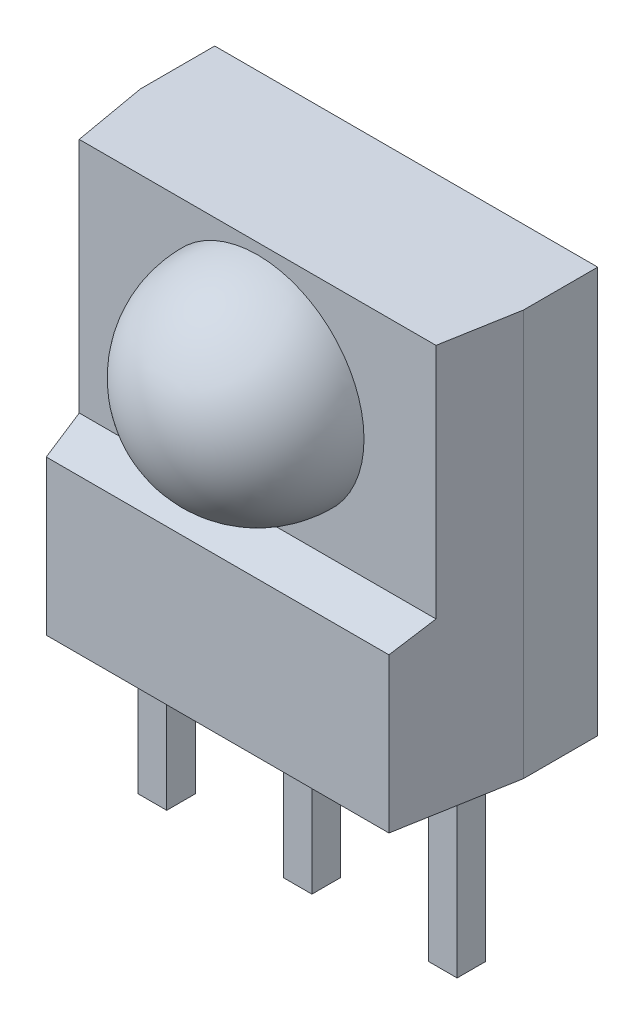
ISO-10303-21;
HEADER;
FILE_DESCRIPTION(('STEP AP214'),'2;1');
FILE_NAME('part.step','',(''),(''),'','','');
FILE_SCHEMA(('AUTOMOTIVE_DESIGN { 1 0 10303 214 1 1 1 1 }'));
ENDSEC;
DATA;
#1=APPLICATION_CONTEXT('core data for automotive mechanical design processes');
#2=APPLICATION_PROTOCOL_DEFINITION('international standard','automotive_design',2000,#1);
#3=PRODUCT_CONTEXT('',#1,'mechanical');
#4=PRODUCT('Part','Part','',(#3));
#5=PRODUCT_RELATED_PRODUCT_CATEGORY('part','',(#4));
#6=PRODUCT_DEFINITION_FORMATION('','',#4);
#7=PRODUCT_DEFINITION_CONTEXT('part definition',#1,'design');
#8=PRODUCT_DEFINITION('design','',#6,#7);
#9=PRODUCT_DEFINITION_SHAPE('','',#8);
#10=(LENGTH_UNIT() NAMED_UNIT(*) SI_UNIT(.MILLI.,.METRE.));
#11=(NAMED_UNIT(*) PLANE_ANGLE_UNIT() SI_UNIT($,.RADIAN.));
#12=(NAMED_UNIT(*) SI_UNIT($,.STERADIAN.) SOLID_ANGLE_UNIT());
#13=UNCERTAINTY_MEASURE_WITH_UNIT(LENGTH_MEASURE(1.E-05),#10,'distance_accuracy_value','');
#14=(GEOMETRIC_REPRESENTATION_CONTEXT(3) GLOBAL_UNCERTAINTY_ASSIGNED_CONTEXT((#13)) GLOBAL_UNIT_ASSIGNED_CONTEXT((#10,
#11,#12)) REPRESENTATION_CONTEXT('',''));
#15=CARTESIAN_POINT('',(0.,0.,0.));
#16=DIRECTION('',(0.,0.,1.));
#17=DIRECTION('',(1.,0.,0.));
#18=AXIS2_PLACEMENT_3D('',#15,#16,#17);
#19=CARTESIAN_POINT('',(0.,0.,0.));
#20=DIRECTION('',(0.,-1.,0.));
#21=DIRECTION('',(0.,0.,-1.));
#22=AXIS2_PLACEMENT_3D('',#19,#20,#21);
#23=PLANE('',#22);
#24=DIRECTION('',(-1.,0.,0.));
#25=VECTOR('',#24,1.);
#26=CARTESIAN_POINT('',(-0.25,0.,0.25));
#27=LINE('',#26,#25);
#28=CARTESIAN_POINT('',(0.249999999999995,0.,0.25));
#29=VERTEX_POINT('',#28);
#30=CARTESIAN_POINT('',(-0.25,0.,0.25));
#31=VERTEX_POINT('',#30);
#32=EDGE_CURVE('E201',#29,#31,#27,.T.);
#33=ORIENTED_EDGE('',*,*,#32,.F.);
#34=DIRECTION('',(0.,0.,1.));
#35=VECTOR('',#34,1.);
#36=CARTESIAN_POINT('',(0.249999999999995,0.,-0.25));
#37=LINE('',#36,#35);
#38=CARTESIAN_POINT('',(0.249999999999995,0.,-0.25));
#39=VERTEX_POINT('',#38);
#40=EDGE_CURVE('E198',#39,#29,#37,.T.);
#41=ORIENTED_EDGE('',*,*,#40,.F.);
#42=DIRECTION('',(1.,0.,0.));
#43=VECTOR('',#42,1.);
#44=CARTESIAN_POINT('',(-0.25,0.,-0.25));
#45=LINE('',#44,#43);
#46=CARTESIAN_POINT('',(-0.25,0.,-0.25));
#47=VERTEX_POINT('',#46);
#48=EDGE_CURVE('E211',#47,#39,#45,.T.);
#49=ORIENTED_EDGE('',*,*,#48,.F.);
#50=DIRECTION('',(0.,0.,-1.));
#51=VECTOR('',#50,1.);
#52=CARTESIAN_POINT('',(-0.25,0.,-0.25));
#53=LINE('',#52,#51);
#54=EDGE_CURVE('E219',#31,#47,#53,.T.);
#55=ORIENTED_EDGE('',*,*,#54,.F.);
#56=EDGE_LOOP('',(#33,#41,#49,#55));
#57=FACE_BOUND('',#56,.T.);
#58=DIRECTION('',(0.,0.,-1.));
#59=VECTOR('',#58,1.);
#60=CARTESIAN_POINT('',(3.34999999999998,0.,1.65));
#61=LINE('',#60,#59);
#62=CARTESIAN_POINT('',(3.34999999999998,0.,-0.350000000000031));
#63=VERTEX_POINT('',#62);
#64=CARTESIAN_POINT('',(3.34999999999998,0.,-1.65));
#65=VERTEX_POINT('',#64);
#66=EDGE_CURVE('E266',#63,#65,#61,.T.);
#67=ORIENTED_EDGE('',*,*,#66,.F.);
#68=DIRECTION('',(0.173648177666927,0.,-0.984807753012209));
#69=VECTOR('',#68,1.);
#70=CARTESIAN_POINT('',(3.18913161473439,0.,0.562329948708015));
#71=LINE('',#70,#69);
#72=CARTESIAN_POINT('',(2.99734603858306,0.,1.65));
#73=VERTEX_POINT('',#72);
#74=EDGE_CURVE('E298',#63,#73,#71,.F.);
#75=ORIENTED_EDGE('',*,*,#74,.T.);
#76=DIRECTION('',(1.,0.,0.));
#77=VECTOR('',#76,1.);
#78=CARTESIAN_POINT('',(-3.35000000000002,0.,1.65));
#79=LINE('',#78,#77);
#80=CARTESIAN_POINT('',(-2.99734603858308,0.,1.65));
#81=VERTEX_POINT('',#80);
#82=EDGE_CURVE('E270',#81,#73,#79,.T.);
#83=ORIENTED_EDGE('',*,*,#82,.F.);
#84=DIRECTION('',(0.173648177666927,0.,0.984807753012209));
#85=VECTOR('',#84,1.);
#86=CARTESIAN_POINT('',(-3.18913161473442,0.,0.56232994870802));
#87=LINE('',#86,#85);
#88=CARTESIAN_POINT('',(-3.35000000000002,0.,-0.350000000000043));
#89=VERTEX_POINT('',#88);
#90=EDGE_CURVE('E296',#81,#89,#87,.F.);
#91=ORIENTED_EDGE('',*,*,#90,.T.);
#92=DIRECTION('',(0.,0.,1.));
#93=VECTOR('',#92,1.);
#94=CARTESIAN_POINT('',(-3.35000000000002,0.,1.65));
#95=LINE('',#94,#93);
#96=CARTESIAN_POINT('',(-3.35000000000002,0.,-1.65));
#97=VERTEX_POINT('',#96);
#98=EDGE_CURVE('E278',#97,#89,#95,.T.);
#99=ORIENTED_EDGE('',*,*,#98,.F.);
#100=DIRECTION('',(-1.,0.,0.));
#101=VECTOR('',#100,1.);
#102=CARTESIAN_POINT('',(-3.35000000000002,0.,-1.65));
#103=LINE('',#102,#101);
#104=EDGE_CURVE('E276',#65,#97,#103,.T.);
#105=ORIENTED_EDGE('',*,*,#104,.F.);
#106=EDGE_LOOP('',(#67,#75,#83,#91,#99,#105));
#107=FACE_BOUND('',#106,.T.);
#108=DIRECTION('',(-1.,0.,0.));
#109=VECTOR('',#108,1.);
#110=CARTESIAN_POINT('',(-2.79,0.,0.25));
#111=LINE('',#110,#109);
#112=CARTESIAN_POINT('',(-2.29000000000001,0.,0.25));
#113=VERTEX_POINT('',#112);
#114=CARTESIAN_POINT('',(-2.79,0.,0.25));
#115=VERTEX_POINT('',#114);
#116=EDGE_CURVE('E246',#113,#115,#111,.T.);
#117=ORIENTED_EDGE('',*,*,#116,.F.);
#118=DIRECTION('',(0.,0.,1.));
#119=VECTOR('',#118,1.);
#120=CARTESIAN_POINT('',(-2.29000000000001,0.,-0.25));
#121=LINE('',#120,#119);
#122=CARTESIAN_POINT('',(-2.29000000000001,0.,-0.25));
#123=VERTEX_POINT('',#122);
#124=EDGE_CURVE('E232',#123,#113,#121,.T.);
#125=ORIENTED_EDGE('',*,*,#124,.F.);
#126=DIRECTION('',(1.,0.,0.));
#127=VECTOR('',#126,1.);
#128=CARTESIAN_POINT('',(-2.79,0.,-0.25));
#129=LINE('',#128,#127);
#130=CARTESIAN_POINT('',(-2.79,0.,-0.25));
#131=VERTEX_POINT('',#130);
#132=EDGE_CURVE('E237',#131,#123,#129,.T.);
#133=ORIENTED_EDGE('',*,*,#132,.F.);
#134=DIRECTION('',(0.,0.,-1.));
#135=VECTOR('',#134,1.);
#136=CARTESIAN_POINT('',(-2.79,0.,-0.25));
#137=LINE('',#136,#135);
#138=EDGE_CURVE('E248',#115,#131,#137,.T.);
#139=ORIENTED_EDGE('',*,*,#138,.F.);
#140=EDGE_LOOP('',(#117,#125,#133,#139));
#141=FACE_BOUND('',#140,.T.);
#142=DIRECTION('',(-1.,0.,0.));
#143=VECTOR('',#142,1.);
#144=CARTESIAN_POINT('',(2.29,0.,0.25));
#145=LINE('',#144,#143);
#146=CARTESIAN_POINT('',(2.78999999999999,0.,0.25));
#147=VERTEX_POINT('',#146);
#148=CARTESIAN_POINT('',(2.29,0.,0.25));
#149=VERTEX_POINT('',#148);
#150=EDGE_CURVE('E597',#147,#149,#145,.T.);
#151=ORIENTED_EDGE('',*,*,#150,.F.);
#152=DIRECTION('',(0.,0.,1.));
#153=VECTOR('',#152,1.);
#154=CARTESIAN_POINT('',(2.78999999999999,0.,-0.25));
#155=LINE('',#154,#153);
#156=CARTESIAN_POINT('',(2.78999999999999,0.,-0.25));
#157=VERTEX_POINT('',#156);
#158=EDGE_CURVE('E196',#157,#147,#155,.T.);
#159=ORIENTED_EDGE('',*,*,#158,.F.);
#160=DIRECTION('',(1.,0.,0.));
#161=VECTOR('',#160,1.);
#162=CARTESIAN_POINT('',(2.29,0.,-0.25));
#163=LINE('',#162,#161);
#164=CARTESIAN_POINT('',(2.29,0.,-0.25));
#165=VERTEX_POINT('',#164);
#166=EDGE_CURVE('E192',#165,#157,#163,.T.);
#167=ORIENTED_EDGE('',*,*,#166,.F.);
#168=DIRECTION('',(0.,0.,-1.));
#169=VECTOR('',#168,1.);
#170=CARTESIAN_POINT('',(2.29,0.,-0.25));
#171=LINE('',#170,#169);
#172=EDGE_CURVE('E600',#149,#165,#171,.T.);
#173=ORIENTED_EDGE('',*,*,#172,.F.);
#174=EDGE_LOOP('',(#151,#159,#167,#173));
#175=FACE_BOUND('',#174,.T.);
#176=ADVANCED_FACE('F35',(#57,#107,#141,#175),#23,.T.);
#177=CARTESIAN_POINT('',(0.,0.,0.949999999999999));
#178=DIRECTION('',(0.,0.,1.));
#179=DIRECTION('',(1.,0.,0.));
#180=AXIS2_PLACEMENT_3D('',#177,#178,#179);
#181=PLANE('',#180);
#182=DIRECTION('',(-1.,0.,0.));
#183=VECTOR('',#182,1.);
#184=CARTESIAN_POINT('',(-3.35000000000001,2.95477916398633,0.949999999999999));
#185=LINE('',#184,#183);
#186=CARTESIAN_POINT('',(-3.12077492507901,2.95477916398633,0.949999999999999));
#187=VERTEX_POINT('',#186);
#188=CARTESIAN_POINT('',(3.12077492507898,2.95477916398633,0.949999999999999));
#189=VERTEX_POINT('',#188);
#190=EDGE_CURVE('E290',#187,#189,#185,.F.);
#191=ORIENTED_EDGE('',*,*,#190,.T.);
#192=DIRECTION('',(0.,-1.,0.));
#193=VECTOR('',#192,1.);
#194=CARTESIAN_POINT('',(3.12077492507898,0.,0.949999999999999));
#195=LINE('',#194,#193);
#196=CARTESIAN_POINT('',(3.12077492507898,7.1,0.949999999999999));
#197=VERTEX_POINT('',#196);
#198=EDGE_CURVE('E311',#189,#197,#195,.F.);
#199=ORIENTED_EDGE('',*,*,#198,.T.);
#200=DIRECTION('',(-1.,0.,0.));
#201=VECTOR('',#200,1.);
#202=CARTESIAN_POINT('',(-3.35000000000002,7.1,0.949999999999999));
#203=LINE('',#202,#201);
#204=CARTESIAN_POINT('',(-3.12077492507901,7.1,0.949999999999999));
#205=VERTEX_POINT('',#204);
#206=EDGE_CURVE('E264',#197,#205,#203,.T.);
#207=ORIENTED_EDGE('',*,*,#206,.T.);
#208=DIRECTION('',(0.,1.,0.));
#209=VECTOR('',#208,1.);
#210=CARTESIAN_POINT('',(-3.12077492507901,0.,0.949999999999999));
#211=LINE('',#210,#209);
#212=EDGE_CURVE('E309',#205,#187,#211,.F.);
#213=ORIENTED_EDGE('',*,*,#212,.T.);
#214=EDGE_LOOP('',(#191,#199,#207,#213));
#215=FACE_BOUND('',#214,.T.);
#216=CARTESIAN_POINT('',(0.,5.05,0.949999999999999));
#217=DIRECTION('',(0.,0.,-1.));
#218=DIRECTION('',(-1.,0.,0.));
#219=AXIS2_PLACEMENT_3D('',#216,#217,#218);
#220=CIRCLE('',#219,1.86100349454776);
#221=CARTESIAN_POINT('',(-1.86100349454777,5.05,0.949999999999986));
#222=VERTEX_POINT('',#221);
#223=EDGE_CURVE('E261',#222,#222,#220,.T.);
#224=ORIENTED_EDGE('',*,*,#223,.T.);
#225=EDGE_LOOP('',(#224));
#226=FACE_BOUND('',#225,.T.);
#227=ADVANCED_FACE('F345',(#215,#226),#181,.T.);
#228=CARTESIAN_POINT('',(0.,7.1,0.));
#229=DIRECTION('',(0.,-1.,0.));
#230=DIRECTION('',(0.,0.,-1.));
#231=AXIS2_PLACEMENT_3D('',#228,#229,#230);
#232=PLANE('',#231);
#233=ORIENTED_EDGE('',*,*,#206,.F.);
#234=DIRECTION('',(-0.173648177666927,0.,0.984807753012209));
#235=VECTOR('',#234,1.);
#236=CARTESIAN_POINT('',(3.34999999999998,7.1,-0.350000000000038));
#237=LINE('',#236,#235);
#238=CARTESIAN_POINT('',(3.34999999999998,7.1,-0.350000000000024));
#239=VERTEX_POINT('',#238);
#240=EDGE_CURVE('E43',#197,#239,#237,.F.);
#241=ORIENTED_EDGE('',*,*,#240,.T.);
#242=DIRECTION('',(0.,0.,-1.));
#243=VECTOR('',#242,1.);
#244=CARTESIAN_POINT('',(3.34999999999998,7.1,1.65));
#245=LINE('',#244,#243);
#246=CARTESIAN_POINT('',(3.34999999999998,7.1,-1.65));
#247=VERTEX_POINT('',#246);
#248=EDGE_CURVE('E267',#239,#247,#245,.T.);
#249=ORIENTED_EDGE('',*,*,#248,.T.);
#250=DIRECTION('',(-1.,0.,0.));
#251=VECTOR('',#250,1.);
#252=CARTESIAN_POINT('',(-3.35000000000002,7.1,-1.65));
#253=LINE('',#252,#251);
#254=CARTESIAN_POINT('',(-3.35000000000002,7.1,-1.65));
#255=VERTEX_POINT('',#254);
#256=EDGE_CURVE('E269',#247,#255,#253,.T.);
#257=ORIENTED_EDGE('',*,*,#256,.T.);
#258=DIRECTION('',(0.,0.,1.));
#259=VECTOR('',#258,1.);
#260=CARTESIAN_POINT('',(-3.35000000000002,7.1,1.65));
#261=LINE('',#260,#259);
#262=CARTESIAN_POINT('',(-3.35000000000002,7.1,-0.350000000000043));
#263=VERTEX_POINT('',#262);
#264=EDGE_CURVE('E272',#255,#263,#261,.T.);
#265=ORIENTED_EDGE('',*,*,#264,.T.);
#266=DIRECTION('',(-0.173648177666927,0.,-0.984807753012209));
#267=VECTOR('',#266,1.);
#268=CARTESIAN_POINT('',(-2.99734603858308,7.1,1.65));
#269=LINE('',#268,#267);
#270=EDGE_CURVE('E55',#263,#205,#269,.F.);
#271=ORIENTED_EDGE('',*,*,#270,.T.);
#272=EDGE_LOOP('',(#233,#241,#249,#257,#265,#271));
#273=FACE_BOUND('',#272,.T.);
#274=ADVANCED_FACE('F315',(#273),#232,.F.);
#275=CARTESIAN_POINT('',(3.34999999999998,7.1,1.65));
#276=DIRECTION('',(-1.,0.,0.));
#277=DIRECTION('',(0.,0.,1.));
#278=AXIS2_PLACEMENT_3D('',#275,#276,#277);
#279=PLANE('',#278);
#280=ORIENTED_EDGE('',*,*,#248,.F.);
#281=DIRECTION('',(0.,-1.,0.));
#282=VECTOR('',#281,1.);
#283=CARTESIAN_POINT('',(3.34999999999998,7.1,-0.350000000000038));
#284=LINE('',#283,#282);
#285=EDGE_CURVE('E293',#239,#63,#284,.T.);
#286=ORIENTED_EDGE('',*,*,#285,.T.);
#287=ORIENTED_EDGE('',*,*,#66,.T.);
#288=DIRECTION('',(0.,-1.,0.));
#289=VECTOR('',#288,1.);
#290=CARTESIAN_POINT('',(3.34999999999998,7.1,-1.65));
#291=LINE('',#290,#289);
#292=EDGE_CURVE('E284',#247,#65,#291,.T.);
#293=ORIENTED_EDGE('',*,*,#292,.F.);
#294=EDGE_LOOP('',(#280,#286,#287,#293));
#295=FACE_BOUND('',#294,.T.);
#296=ADVANCED_FACE('F322',(#295),#279,.F.);
#297=CARTESIAN_POINT('',(-3.35000000000002,7.1,-1.65));
#298=DIRECTION('',(0.,0.,1.));
#299=DIRECTION('',(1.,0.,0.));
#300=AXIS2_PLACEMENT_3D('',#297,#298,#299);
#301=PLANE('',#300);
#302=ORIENTED_EDGE('',*,*,#104,.T.);
#303=DIRECTION('',(0.,-1.,0.));
#304=VECTOR('',#303,1.);
#305=CARTESIAN_POINT('',(-3.35000000000002,7.1,-1.65));
#306=LINE('',#305,#304);
#307=EDGE_CURVE('E274',#255,#97,#306,.T.);
#308=ORIENTED_EDGE('',*,*,#307,.F.);
#309=ORIENTED_EDGE('',*,*,#256,.F.);
#310=ORIENTED_EDGE('',*,*,#292,.T.);
#311=EDGE_LOOP('',(#302,#308,#309,#310));
#312=FACE_BOUND('',#311,.T.);
#313=ADVANCED_FACE('F342',(#312),#301,.F.);
#314=CARTESIAN_POINT('',(-3.35000000000002,7.1,1.65));
#315=DIRECTION('',(1.,0.,0.));
#316=DIRECTION('',(0.,0.,-1.));
#317=AXIS2_PLACEMENT_3D('',#314,#315,#316);
#318=PLANE('',#317);
#319=ORIENTED_EDGE('',*,*,#98,.T.);
#320=DIRECTION('',(0.,1.,0.));
#321=VECTOR('',#320,1.);
#322=CARTESIAN_POINT('',(-3.35000000000002,7.1,-0.350000000000043));
#323=LINE('',#322,#321);
#324=EDGE_CURVE('E11',#89,#263,#323,.T.);
#325=ORIENTED_EDGE('',*,*,#324,.T.);
#326=ORIENTED_EDGE('',*,*,#264,.F.);
#327=ORIENTED_EDGE('',*,*,#307,.T.);
#328=EDGE_LOOP('',(#319,#325,#326,#327));
#329=FACE_BOUND('',#328,.T.);
#330=ADVANCED_FACE('F339',(#329),#318,.F.);
#331=CARTESIAN_POINT('',(-3.35000000000002,7.1,1.65));
#332=DIRECTION('',(0.,0.,-1.));
#333=DIRECTION('',(-1.,0.,0.));
#334=AXIS2_PLACEMENT_3D('',#331,#332,#333);
#335=PLANE('',#334);
#336=ORIENTED_EDGE('',*,*,#82,.T.);
#337=DIRECTION('',(0.,1.,0.));
#338=VECTOR('',#337,1.);
#339=CARTESIAN_POINT('',(2.99734603858306,7.1,1.65));
#340=LINE('',#339,#338);
#341=CARTESIAN_POINT('',(2.99734603858305,2.69999999999999,1.65));
#342=VERTEX_POINT('',#341);
#343=EDGE_CURVE('E303',#73,#342,#340,.T.);
#344=ORIENTED_EDGE('',*,*,#343,.T.);
#345=DIRECTION('',(-1.,0.,0.));
#346=VECTOR('',#345,1.);
#347=CARTESIAN_POINT('',(-3.35000000000002,2.69999999999999,1.65));
#348=LINE('',#347,#346);
#349=CARTESIAN_POINT('',(-2.99734603858309,2.69999999999999,1.65));
#350=VERTEX_POINT('',#349);
#351=EDGE_CURVE('E287',#342,#350,#348,.T.);
#352=ORIENTED_EDGE('',*,*,#351,.T.);
#353=DIRECTION('',(0.,-1.,0.));
#354=VECTOR('',#353,1.);
#355=CARTESIAN_POINT('',(-2.99734603858308,7.1,1.65));
#356=LINE('',#355,#354);
#357=EDGE_CURVE('E300',#350,#81,#356,.T.);
#358=ORIENTED_EDGE('',*,*,#357,.T.);
#359=EDGE_LOOP('',(#336,#344,#352,#358));
#360=FACE_BOUND('',#359,.T.);
#361=ADVANCED_FACE('F332',(#360),#335,.F.);
#362=CARTESIAN_POINT('',(0.,5.05,0.949999999999999));
#363=DIRECTION('',(0.,1.,0.));
#364=DIRECTION('',(-1.,0.,0.));
#365=AXIS2_PLACEMENT_3D('',#362,#363,#364);
#366=SPHERICAL_SURFACE('',#365,1.86100349454776);
#367=CARTESIAN_POINT('',(0.,5.05,0.949999999999999));
#368=DIRECTION('',(0.,0.,-1.));
#369=DIRECTION('',(-1.,0.,0.));
#370=AXIS2_PLACEMENT_3D('',#367,#368,#369);
#371=SPHERICAL_SURFACE('',#370,1.86100349454776);
#372=ORIENTED_EDGE('',*,*,#223,.F.);
#373=EDGE_LOOP('',(#372));
#374=FACE_BOUND('',#373,.T.);
#375=ADVANCED_FACE('F370',(#374),#371,.T.);
#376=CARTESIAN_POINT('',(-2.29000000000001,-3.,-0.25));
#377=DIRECTION('',(-1.,0.,0.));
#378=DIRECTION('',(0.,0.,1.));
#379=AXIS2_PLACEMENT_3D('',#376,#377,#378);
#380=PLANE('',#379);
#381=ORIENTED_EDGE('',*,*,#124,.T.);
#382=DIRECTION('',(0.,1.,0.));
#383=VECTOR('',#382,1.);
#384=CARTESIAN_POINT('',(-2.29000000000001,-3.,0.25));
#385=LINE('',#384,#383);
#386=CARTESIAN_POINT('',(-2.29000000000001,-3.,0.25));
#387=VERTEX_POINT('',#386);
#388=EDGE_CURVE('E259',#387,#113,#385,.T.);
#389=ORIENTED_EDGE('',*,*,#388,.F.);
#390=DIRECTION('',(0.,0.,1.));
#391=VECTOR('',#390,1.);
#392=CARTESIAN_POINT('',(-2.29000000000001,-3.,-0.25));
#393=LINE('',#392,#391);
#394=CARTESIAN_POINT('',(-2.29000000000001,-3.,-0.25));
#395=VERTEX_POINT('',#394);
#396=EDGE_CURVE('E233',#395,#387,#393,.T.);
#397=ORIENTED_EDGE('',*,*,#396,.F.);
#398=DIRECTION('',(0.,1.,0.));
#399=VECTOR('',#398,1.);
#400=CARTESIAN_POINT('',(-2.29000000000001,-3.,-0.25));
#401=LINE('',#400,#399);
#402=EDGE_CURVE('E243',#395,#123,#401,.T.);
#403=ORIENTED_EDGE('',*,*,#402,.T.);
#404=EDGE_LOOP('',(#381,#389,#397,#403));
#405=FACE_BOUND('',#404,.T.);
#406=ADVANCED_FACE('F522',(#405),#380,.F.);
#407=CARTESIAN_POINT('',(-2.79,-3.,0.25));
#408=DIRECTION('',(0.,0.,-1.));
#409=DIRECTION('',(-1.,0.,0.));
#410=AXIS2_PLACEMENT_3D('',#407,#408,#409);
#411=PLANE('',#410);
#412=ORIENTED_EDGE('',*,*,#116,.T.);
#413=DIRECTION('',(0.,1.,0.));
#414=VECTOR('',#413,1.);
#415=CARTESIAN_POINT('',(-2.79,-3.,0.25));
#416=LINE('',#415,#414);
#417=CARTESIAN_POINT('',(-2.79,-3.,0.25));
#418=VERTEX_POINT('',#417);
#419=EDGE_CURVE('E256',#418,#115,#416,.T.);
#420=ORIENTED_EDGE('',*,*,#419,.F.);
#421=DIRECTION('',(-1.,0.,0.));
#422=VECTOR('',#421,1.);
#423=CARTESIAN_POINT('',(-2.79,-3.,0.25));
#424=LINE('',#423,#422);
#425=EDGE_CURVE('E236',#387,#418,#424,.T.);
#426=ORIENTED_EDGE('',*,*,#425,.F.);
#427=ORIENTED_EDGE('',*,*,#388,.T.);
#428=EDGE_LOOP('',(#412,#420,#426,#427));
#429=FACE_BOUND('',#428,.T.);
#430=ADVANCED_FACE('F512',(#429),#411,.F.);
#431=CARTESIAN_POINT('',(-2.79,-3.,-0.25));
#432=DIRECTION('',(1.,0.,0.));
#433=DIRECTION('',(0.,0.,-1.));
#434=AXIS2_PLACEMENT_3D('',#431,#432,#433);
#435=PLANE('',#434);
#436=ORIENTED_EDGE('',*,*,#138,.T.);
#437=DIRECTION('',(0.,1.,0.));
#438=VECTOR('',#437,1.);
#439=CARTESIAN_POINT('',(-2.79,-3.,-0.25));
#440=LINE('',#439,#438);
#441=CARTESIAN_POINT('',(-2.79,-3.,-0.25));
#442=VERTEX_POINT('',#441);
#443=EDGE_CURVE('E254',#442,#131,#440,.T.);
#444=ORIENTED_EDGE('',*,*,#443,.F.);
#445=DIRECTION('',(0.,0.,-1.));
#446=VECTOR('',#445,1.);
#447=CARTESIAN_POINT('',(-2.79,-3.,-0.25));
#448=LINE('',#447,#446);
#449=EDGE_CURVE('E239',#418,#442,#448,.T.);
#450=ORIENTED_EDGE('',*,*,#449,.F.);
#451=ORIENTED_EDGE('',*,*,#419,.T.);
#452=EDGE_LOOP('',(#436,#444,#450,#451));
#453=FACE_BOUND('',#452,.T.);
#454=ADVANCED_FACE('F502',(#453),#435,.F.);
#455=CARTESIAN_POINT('',(-2.79,-3.,-0.25));
#456=DIRECTION('',(0.,0.,1.));
#457=DIRECTION('',(1.,0.,0.));
#458=AXIS2_PLACEMENT_3D('',#455,#456,#457);
#459=PLANE('',#458);
#460=ORIENTED_EDGE('',*,*,#132,.T.);
#461=ORIENTED_EDGE('',*,*,#402,.F.);
#462=DIRECTION('',(1.,0.,0.));
#463=VECTOR('',#462,1.);
#464=CARTESIAN_POINT('',(-2.79,-3.,-0.25));
#465=LINE('',#464,#463);
#466=EDGE_CURVE('E241',#442,#395,#465,.T.);
#467=ORIENTED_EDGE('',*,*,#466,.F.);
#468=ORIENTED_EDGE('',*,*,#443,.T.);
#469=EDGE_LOOP('',(#460,#461,#467,#468));
#470=FACE_BOUND('',#469,.T.);
#471=ADVANCED_FACE('F492',(#470),#459,.F.);
#472=CARTESIAN_POINT('',(0.,-3.,0.));
#473=DIRECTION('',(0.,1.,0.));
#474=DIRECTION('',(0.,0.,1.));
#475=AXIS2_PLACEMENT_3D('',#472,#473,#474);
#476=PLANE('',#475);
#477=ORIENTED_EDGE('',*,*,#396,.T.);
#478=ORIENTED_EDGE('',*,*,#425,.T.);
#479=ORIENTED_EDGE('',*,*,#449,.T.);
#480=ORIENTED_EDGE('',*,*,#466,.T.);
#481=EDGE_LOOP('',(#477,#478,#479,#480));
#482=FACE_BOUND('',#481,.T.);
#483=ADVANCED_FACE('F482',(#482),#476,.F.);
#484=CARTESIAN_POINT('',(0.249999999999995,-3.,-0.25));
#485=DIRECTION('',(-1.,0.,0.));
#486=DIRECTION('',(0.,0.,1.));
#487=AXIS2_PLACEMENT_3D('',#484,#485,#486);
#488=PLANE('',#487);
#489=ORIENTED_EDGE('',*,*,#40,.T.);
#490=DIRECTION('',(0.,1.,0.));
#491=VECTOR('',#490,1.);
#492=CARTESIAN_POINT('',(0.249999999999995,-3.,0.25));
#493=LINE('',#492,#491);
#494=CARTESIAN_POINT('',(0.249999999999995,-3.,0.25));
#495=VERTEX_POINT('',#494);
#496=EDGE_CURVE('E230',#495,#29,#493,.T.);
#497=ORIENTED_EDGE('',*,*,#496,.F.);
#498=DIRECTION('',(0.,0.,1.));
#499=VECTOR('',#498,1.);
#500=CARTESIAN_POINT('',(0.249999999999995,-3.,-0.25));
#501=LINE('',#500,#499);
#502=CARTESIAN_POINT('',(0.249999999999995,-3.,-0.25));
#503=VERTEX_POINT('',#502);
#504=EDGE_CURVE('E207',#503,#495,#501,.T.);
#505=ORIENTED_EDGE('',*,*,#504,.F.);
#506=DIRECTION('',(0.,1.,0.));
#507=VECTOR('',#506,1.);
#508=CARTESIAN_POINT('',(0.249999999999995,-3.,-0.25));
#509=LINE('',#508,#507);
#510=EDGE_CURVE('E216',#503,#39,#509,.T.);
#511=ORIENTED_EDGE('',*,*,#510,.T.);
#512=EDGE_LOOP('',(#489,#497,#505,#511));
#513=FACE_BOUND('',#512,.T.);
#514=ADVANCED_FACE('F472',(#513),#488,.F.);
#515=CARTESIAN_POINT('',(-0.25,-3.,0.25));
#516=DIRECTION('',(0.,0.,-1.));
#517=DIRECTION('',(-1.,0.,0.));
#518=AXIS2_PLACEMENT_3D('',#515,#516,#517);
#519=PLANE('',#518);
#520=ORIENTED_EDGE('',*,*,#32,.T.);
#521=DIRECTION('',(0.,1.,0.));
#522=VECTOR('',#521,1.);
#523=CARTESIAN_POINT('',(-0.25,-3.,0.25));
#524=LINE('',#523,#522);
#525=CARTESIAN_POINT('',(-0.25,-3.,0.25));
#526=VERTEX_POINT('',#525);
#527=EDGE_CURVE('E227',#526,#31,#524,.T.);
#528=ORIENTED_EDGE('',*,*,#527,.F.);
#529=DIRECTION('',(-1.,0.,0.));
#530=VECTOR('',#529,1.);
#531=CARTESIAN_POINT('',(-0.25,-3.,0.25));
#532=LINE('',#531,#530);
#533=EDGE_CURVE('E210',#495,#526,#532,.T.);
#534=ORIENTED_EDGE('',*,*,#533,.F.);
#535=ORIENTED_EDGE('',*,*,#496,.T.);
#536=EDGE_LOOP('',(#520,#528,#534,#535));
#537=FACE_BOUND('',#536,.T.);
#538=ADVANCED_FACE('F462',(#537),#519,.F.);
#539=CARTESIAN_POINT('',(-0.25,-3.,-0.25));
#540=DIRECTION('',(1.,0.,0.));
#541=DIRECTION('',(0.,0.,-1.));
#542=AXIS2_PLACEMENT_3D('',#539,#540,#541);
#543=PLANE('',#542);
#544=ORIENTED_EDGE('',*,*,#54,.T.);
#545=DIRECTION('',(0.,1.,0.));
#546=VECTOR('',#545,1.);
#547=CARTESIAN_POINT('',(-0.25,-3.,-0.25));
#548=LINE('',#547,#546);
#549=CARTESIAN_POINT('',(-0.25,-3.,-0.25));
#550=VERTEX_POINT('',#549);
#551=EDGE_CURVE('E225',#550,#47,#548,.T.);
#552=ORIENTED_EDGE('',*,*,#551,.F.);
#553=DIRECTION('',(0.,0.,-1.));
#554=VECTOR('',#553,1.);
#555=CARTESIAN_POINT('',(-0.25,-3.,-0.25));
#556=LINE('',#555,#554);
#557=EDGE_CURVE('E213',#526,#550,#556,.T.);
#558=ORIENTED_EDGE('',*,*,#557,.F.);
#559=ORIENTED_EDGE('',*,*,#527,.T.);
#560=EDGE_LOOP('',(#544,#552,#558,#559));
#561=FACE_BOUND('',#560,.T.);
#562=ADVANCED_FACE('F452',(#561),#543,.F.);
#563=CARTESIAN_POINT('',(-0.25,-3.,-0.25));
#564=DIRECTION('',(0.,0.,1.));
#565=DIRECTION('',(1.,0.,0.));
#566=AXIS2_PLACEMENT_3D('',#563,#564,#565);
#567=PLANE('',#566);
#568=ORIENTED_EDGE('',*,*,#48,.T.);
#569=ORIENTED_EDGE('',*,*,#510,.F.);
#570=DIRECTION('',(1.,0.,0.));
#571=VECTOR('',#570,1.);
#572=CARTESIAN_POINT('',(-0.25,-3.,-0.25));
#573=LINE('',#572,#571);
#574=EDGE_CURVE('E215',#550,#503,#573,.T.);
#575=ORIENTED_EDGE('',*,*,#574,.F.);
#576=ORIENTED_EDGE('',*,*,#551,.T.);
#577=EDGE_LOOP('',(#568,#569,#575,#576));
#578=FACE_BOUND('',#577,.T.);
#579=ADVANCED_FACE('F442',(#578),#567,.F.);
#580=CARTESIAN_POINT('',(0.,-3.,0.));
#581=DIRECTION('',(0.,1.,0.));
#582=DIRECTION('',(0.,0.,1.));
#583=AXIS2_PLACEMENT_3D('',#580,#581,#582);
#584=PLANE('',#583);
#585=ORIENTED_EDGE('',*,*,#504,.T.);
#586=ORIENTED_EDGE('',*,*,#533,.T.);
#587=ORIENTED_EDGE('',*,*,#557,.T.);
#588=ORIENTED_EDGE('',*,*,#574,.T.);
#589=EDGE_LOOP('',(#585,#586,#587,#588));
#590=FACE_BOUND('',#589,.T.);
#591=ADVANCED_FACE('F433',(#590),#584,.F.);
#592=CARTESIAN_POINT('',(2.78999999999999,-3.,-0.25));
#593=DIRECTION('',(-1.,0.,0.));
#594=DIRECTION('',(0.,0.,1.));
#595=AXIS2_PLACEMENT_3D('',#592,#593,#594);
#596=PLANE('',#595);
#597=ORIENTED_EDGE('',*,*,#158,.T.);
#598=DIRECTION('',(0.,1.,0.));
#599=VECTOR('',#598,1.);
#600=CARTESIAN_POINT('',(2.78999999999999,-3.,0.25));
#601=LINE('',#600,#599);
#602=CARTESIAN_POINT('',(2.78999999999999,-3.,0.25));
#603=VERTEX_POINT('',#602);
#604=EDGE_CURVE('E176',#603,#147,#601,.T.);
#605=ORIENTED_EDGE('',*,*,#604,.F.);
#606=DIRECTION('',(0.,0.,1.));
#607=VECTOR('',#606,1.);
#608=CARTESIAN_POINT('',(2.78999999999999,-3.,-0.25));
#609=LINE('',#608,#607);
#610=CARTESIAN_POINT('',(2.78999999999999,-3.,-0.25));
#611=VERTEX_POINT('',#610);
#612=EDGE_CURVE('E183',#611,#603,#609,.T.);
#613=ORIENTED_EDGE('',*,*,#612,.F.);
#614=DIRECTION('',(0.,1.,0.));
#615=VECTOR('',#614,1.);
#616=CARTESIAN_POINT('',(2.78999999999999,-3.,-0.25));
#617=LINE('',#616,#615);
#618=EDGE_CURVE('E607',#611,#157,#617,.T.);
#619=ORIENTED_EDGE('',*,*,#618,.T.);
#620=EDGE_LOOP('',(#597,#605,#613,#619));
#621=FACE_BOUND('',#620,.T.);
#622=ADVANCED_FACE('F194',(#621),#596,.F.);
#623=CARTESIAN_POINT('',(2.29,-3.,0.25));
#624=DIRECTION('',(0.,0.,-1.));
#625=DIRECTION('',(-1.,0.,0.));
#626=AXIS2_PLACEMENT_3D('',#623,#624,#625);
#627=PLANE('',#626);
#628=ORIENTED_EDGE('',*,*,#150,.T.);
#629=DIRECTION('',(0.,1.,0.));
#630=VECTOR('',#629,1.);
#631=CARTESIAN_POINT('',(2.29,-3.,0.25));
#632=LINE('',#631,#630);
#633=CARTESIAN_POINT('',(2.29,-3.,0.25));
#634=VERTEX_POINT('',#633);
#635=EDGE_CURVE('E179',#634,#149,#632,.T.);
#636=ORIENTED_EDGE('',*,*,#635,.F.);
#637=DIRECTION('',(-1.,0.,0.));
#638=VECTOR('',#637,1.);
#639=CARTESIAN_POINT('',(2.29,-3.,0.25));
#640=LINE('',#639,#638);
#641=EDGE_CURVE('E172',#603,#634,#640,.T.);
#642=ORIENTED_EDGE('',*,*,#641,.F.);
#643=ORIENTED_EDGE('',*,*,#604,.T.);
#644=EDGE_LOOP('',(#628,#636,#642,#643));
#645=FACE_BOUND('',#644,.T.);
#646=ADVANCED_FACE('F174',(#645),#627,.F.);
#647=CARTESIAN_POINT('',(2.29,-3.,-0.25));
#648=DIRECTION('',(1.,0.,0.));
#649=DIRECTION('',(0.,0.,-1.));
#650=AXIS2_PLACEMENT_3D('',#647,#648,#649);
#651=PLANE('',#650);
#652=ORIENTED_EDGE('',*,*,#172,.T.);
#653=DIRECTION('',(0.,1.,0.));
#654=VECTOR('',#653,1.);
#655=CARTESIAN_POINT('',(2.29,-3.,-0.25));
#656=LINE('',#655,#654);
#657=CARTESIAN_POINT('',(2.29,-3.,-0.25));
#658=VERTEX_POINT('',#657);
#659=EDGE_CURVE('E203',#658,#165,#656,.T.);
#660=ORIENTED_EDGE('',*,*,#659,.F.);
#661=DIRECTION('',(0.,0.,-1.));
#662=VECTOR('',#661,1.);
#663=CARTESIAN_POINT('',(2.29,-3.,-0.25));
#664=LINE('',#663,#662);
#665=EDGE_CURVE('E182',#634,#658,#664,.T.);
#666=ORIENTED_EDGE('',*,*,#665,.F.);
#667=ORIENTED_EDGE('',*,*,#635,.T.);
#668=EDGE_LOOP('',(#652,#660,#666,#667));
#669=FACE_BOUND('',#668,.T.);
#670=ADVANCED_FACE('F406',(#669),#651,.F.);
#671=CARTESIAN_POINT('',(2.29,-3.,-0.25));
#672=DIRECTION('',(0.,0.,1.));
#673=DIRECTION('',(1.,0.,0.));
#674=AXIS2_PLACEMENT_3D('',#671,#672,#673);
#675=PLANE('',#674);
#676=ORIENTED_EDGE('',*,*,#166,.T.);
#677=ORIENTED_EDGE('',*,*,#618,.F.);
#678=DIRECTION('',(1.,0.,0.));
#679=VECTOR('',#678,1.);
#680=CARTESIAN_POINT('',(2.29,-3.,-0.25));
#681=LINE('',#680,#679);
#682=EDGE_CURVE('E188',#658,#611,#681,.T.);
#683=ORIENTED_EDGE('',*,*,#682,.F.);
#684=ORIENTED_EDGE('',*,*,#659,.T.);
#685=EDGE_LOOP('',(#676,#677,#683,#684));
#686=FACE_BOUND('',#685,.T.);
#687=ADVANCED_FACE('F355',(#686),#675,.F.);
#688=CARTESIAN_POINT('',(0.,-3.,0.));
#689=DIRECTION('',(0.,1.,0.));
#690=DIRECTION('',(0.,0.,1.));
#691=AXIS2_PLACEMENT_3D('',#688,#689,#690);
#692=PLANE('',#691);
#693=ORIENTED_EDGE('',*,*,#612,.T.);
#694=ORIENTED_EDGE('',*,*,#641,.T.);
#695=ORIENTED_EDGE('',*,*,#665,.T.);
#696=ORIENTED_EDGE('',*,*,#682,.T.);
#697=EDGE_LOOP('',(#693,#694,#695,#696));
#698=FACE_BOUND('',#697,.T.);
#699=ADVANCED_FACE('F186',(#698),#692,.F.);
#700=CARTESIAN_POINT('',(-3.35000000000001,3.,0.825756774163586));
#701=DIRECTION('',(0.,-0.93969262078591,-0.342020143325665));
#702=DIRECTION('',(1.,0.,0.));
#703=AXIS2_PLACEMENT_3D('',#700,#701,#702);
#704=PLANE('',#703);
#705=ORIENTED_EDGE('',*,*,#351,.F.);
#706=DIRECTION('',(0.163464460888848,0.337419706756521,-0.927053025192552));
#707=VECTOR('',#706,1.);
#708=CARTESIAN_POINT('',(2.96919379514038,2.64188876484029,1.8096593064179));
#709=LINE('',#708,#707);
#710=EDGE_CURVE('E307',#342,#189,#709,.T.);
#711=ORIENTED_EDGE('',*,*,#710,.T.);
#712=ORIENTED_EDGE('',*,*,#190,.F.);
#713=DIRECTION('',(0.163464460888848,-0.337419706756521,0.927053025192552));
#714=VECTOR('',#713,1.);
#715=CARTESIAN_POINT('',(-3.14822201596408,3.01143483891042,0.79433981246211));
#716=LINE('',#715,#714);
#717=EDGE_CURVE('E305',#187,#350,#716,.T.);
#718=ORIENTED_EDGE('',*,*,#717,.T.);
#719=EDGE_LOOP('',(#705,#711,#712,#718));
#720=FACE_BOUND('',#719,.T.);
#721=ADVANCED_FACE('F348',(#720),#704,.F.);
#722=CARTESIAN_POINT('',(3.34999999999998,7.1,-0.350000000000038));
#723=DIRECTION('',(-0.984807753012209,0.,-0.173648177666927));
#724=DIRECTION('',(0.,-1.,0.));
#725=AXIS2_PLACEMENT_3D('',#722,#723,#724);
#726=PLANE('',#725);
#727=ORIENTED_EDGE('',*,*,#710,.F.);
#728=ORIENTED_EDGE('',*,*,#343,.F.);
#729=ORIENTED_EDGE('',*,*,#74,.F.);
#730=ORIENTED_EDGE('',*,*,#285,.F.);
#731=ORIENTED_EDGE('',*,*,#240,.F.);
#732=ORIENTED_EDGE('',*,*,#198,.F.);
#733=EDGE_LOOP('',(#727,#728,#729,#730,#731,#732));
#734=FACE_BOUND('',#733,.T.);
#735=ADVANCED_FACE('F325',(#734),#726,.F.);
#736=CARTESIAN_POINT('',(-2.99734603858308,7.1,1.65));
#737=DIRECTION('',(0.984807753012209,0.,-0.173648177666927));
#738=DIRECTION('',(0.,-1.,0.));
#739=AXIS2_PLACEMENT_3D('',#736,#737,#738);
#740=PLANE('',#739);
#741=ORIENTED_EDGE('',*,*,#270,.F.);
#742=ORIENTED_EDGE('',*,*,#324,.F.);
#743=ORIENTED_EDGE('',*,*,#90,.F.);
#744=ORIENTED_EDGE('',*,*,#357,.F.);
#745=ORIENTED_EDGE('',*,*,#717,.F.);
#746=ORIENTED_EDGE('',*,*,#212,.F.);
#747=EDGE_LOOP('',(#741,#742,#743,#744,#745,#746));
#748=FACE_BOUND('',#747,.T.);
#749=ADVANCED_FACE('F37',(#748),#740,.F.);
#750=CLOSED_SHELL('',(#176,#227,#274,#296,#313,#330,#361,#375,#406,#430,#454,#471,#483,#514,
#538,#562,#579,#591,#622,#646,#670,#687,#699,#721,#735,#749));
#751=MANIFOLD_SOLID_BREP('B2',#750);
#752=ADVANCED_BREP_SHAPE_REPRESENTATION('',(#18,#751),#14);
#753=SHAPE_DEFINITION_REPRESENTATION(#9,#752);
ENDSEC;
END-ISO-10303-21;
